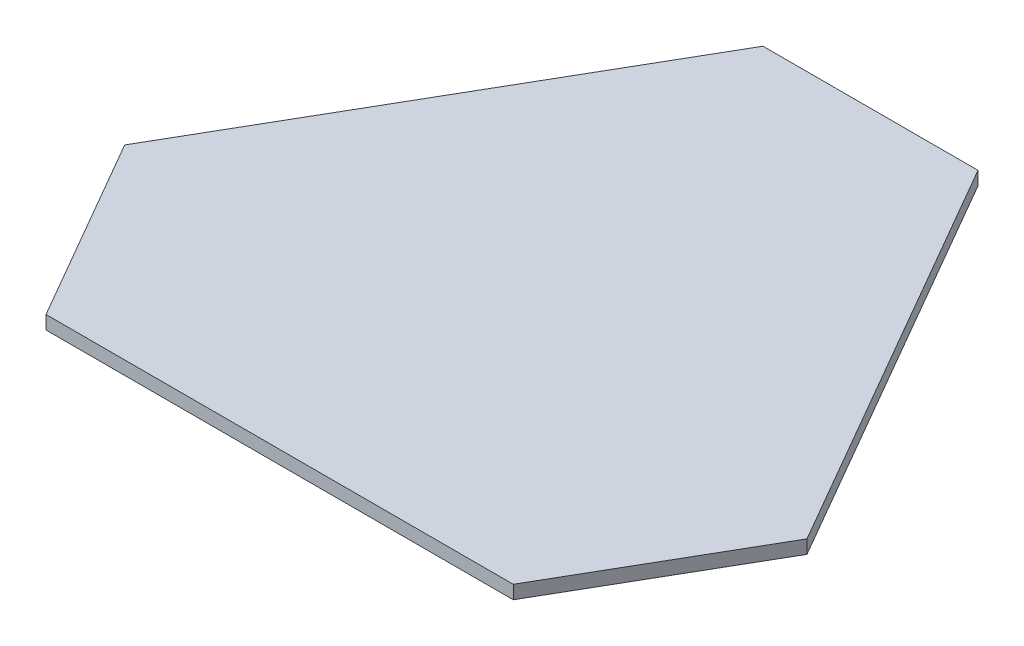
ISO-10303-21;
HEADER;
FILE_DESCRIPTION(('STEP AP214'),'2;1');
FILE_NAME('part.step','',(''),(''),'','','');
FILE_SCHEMA(('AUTOMOTIVE_DESIGN { 1 0 10303 214 1 1 1 1 }'));
ENDSEC;
DATA;
#1=APPLICATION_CONTEXT('core data for automotive mechanical design processes');
#2=APPLICATION_PROTOCOL_DEFINITION('international standard','automotive_design',2000,#1);
#3=PRODUCT_CONTEXT('',#1,'mechanical');
#4=PRODUCT('Part','Part','',(#3));
#5=PRODUCT_RELATED_PRODUCT_CATEGORY('part','',(#4));
#6=PRODUCT_DEFINITION_FORMATION('','',#4);
#7=PRODUCT_DEFINITION_CONTEXT('part definition',#1,'design');
#8=PRODUCT_DEFINITION('design','',#6,#7);
#9=PRODUCT_DEFINITION_SHAPE('','',#8);
#10=(LENGTH_UNIT() NAMED_UNIT(*) SI_UNIT(.MILLI.,.METRE.));
#11=(NAMED_UNIT(*) PLANE_ANGLE_UNIT() SI_UNIT($,.RADIAN.));
#12=(NAMED_UNIT(*) SI_UNIT($,.STERADIAN.) SOLID_ANGLE_UNIT());
#13=UNCERTAINTY_MEASURE_WITH_UNIT(LENGTH_MEASURE(1.E-05),#10,'distance_accuracy_value','');
#14=(GEOMETRIC_REPRESENTATION_CONTEXT(3) GLOBAL_UNCERTAINTY_ASSIGNED_CONTEXT((#13)) GLOBAL_UNIT_ASSIGNED_CONTEXT((#10,
#11,#12)) REPRESENTATION_CONTEXT('',''));
#15=CARTESIAN_POINT('',(0.,0.,0.));
#16=DIRECTION('',(0.,0.,1.));
#17=DIRECTION('',(1.,0.,0.));
#18=AXIS2_PLACEMENT_3D('',#15,#16,#17);
#19=CARTESIAN_POINT('',(-43.2725670041836,-2.5,12.5356925144772));
#20=DIRECTION('',(-0.866025403784438,0.,-0.5));
#21=DIRECTION('',(-0.5,0.,0.866025403784439));
#22=AXIS2_PLACEMENT_3D('',#19,#20,#21);
#23=PLANE('',#22);
#24=DIRECTION('',(-0.5,0.,0.866025403784439));
#25=VECTOR('',#24,1.);
#26=CARTESIAN_POINT('',(-43.2725670041836,0.,12.5356925144772));
#27=LINE('',#26,#25);
#28=CARTESIAN_POINT('',(0.194905288961848,0.,-62.7521779738431));
#29=VERTEX_POINT('',#28);
#30=CARTESIAN_POINT('',(-43.2725670041836,0.,12.5356925144772));
#31=VERTEX_POINT('',#30);
#32=EDGE_CURVE('E119',#29,#31,#27,.T.);
#33=ORIENTED_EDGE('',*,*,#32,.F.);
#34=DIRECTION('',(0.,1.,0.));
#35=VECTOR('',#34,1.);
#36=CARTESIAN_POINT('',(0.194905288961848,-2.5,-62.7521779738431));
#37=LINE('',#36,#35);
#38=CARTESIAN_POINT('',(0.194905288961848,-2.5,-62.7521779738431));
#39=VERTEX_POINT('',#38);
#40=EDGE_CURVE('E11',#39,#29,#37,.T.);
#41=ORIENTED_EDGE('',*,*,#40,.F.);
#42=DIRECTION('',(-0.5,0.,0.866025403784439));
#43=VECTOR('',#42,1.);
#44=CARTESIAN_POINT('',(-43.2725670041836,-2.5,12.5356925144772));
#45=LINE('',#44,#43);
#46=CARTESIAN_POINT('',(-43.2725670041836,-2.5,12.5356925144772));
#47=VERTEX_POINT('',#46);
#48=EDGE_CURVE('E133',#39,#47,#45,.T.);
#49=ORIENTED_EDGE('',*,*,#48,.T.);
#50=DIRECTION('',(0.,1.,0.));
#51=VECTOR('',#50,1.);
#52=CARTESIAN_POINT('',(-43.2725670041836,-2.5,12.5356925144772));
#53=LINE('',#52,#51);
#54=EDGE_CURVE('E37',#47,#31,#53,.T.);
#55=ORIENTED_EDGE('',*,*,#54,.T.);
#56=EDGE_LOOP('',(#33,#41,#49,#55));
#57=FACE_BOUND('',#56,.T.);
#58=ADVANCED_FACE('F34',(#57),#23,.T.);
#59=CARTESIAN_POINT('',(0.194905288961848,-2.5,-62.7521779738431));
#60=DIRECTION('',(0.,0.,-1.));
#61=DIRECTION('',(-1.,0.,0.));
#62=AXIS2_PLACEMENT_3D('',#59,#60,#61);
#63=PLANE('',#62);
#64=DIRECTION('',(-1.,0.,0.));
#65=VECTOR('',#64,1.);
#66=CARTESIAN_POINT('',(0.194905288961848,0.,-62.7521779738431));
#67=LINE('',#66,#65);
#68=CARTESIAN_POINT('',(40.194905196673,0.,-62.7521779738431));
#69=VERTEX_POINT('',#68);
#70=EDGE_CURVE('E131',#69,#29,#67,.T.);
#71=ORIENTED_EDGE('',*,*,#70,.F.);
#72=DIRECTION('',(0.,1.,0.));
#73=VECTOR('',#72,1.);
#74=CARTESIAN_POINT('',(40.194905196673,-2.5,-62.7521779738431));
#75=LINE('',#74,#73);
#76=CARTESIAN_POINT('',(40.194905196673,-2.5,-62.7521779738431));
#77=VERTEX_POINT('',#76);
#78=EDGE_CURVE('E43',#77,#69,#75,.T.);
#79=ORIENTED_EDGE('',*,*,#78,.F.);
#80=DIRECTION('',(-1.,0.,0.));
#81=VECTOR('',#80,1.);
#82=CARTESIAN_POINT('',(0.194905288961848,-2.5,-62.7521779738431));
#83=LINE('',#82,#81);
#84=EDGE_CURVE('E109',#77,#39,#83,.T.);
#85=ORIENTED_EDGE('',*,*,#84,.T.);
#86=ORIENTED_EDGE('',*,*,#40,.T.);
#87=EDGE_LOOP('',(#71,#79,#85,#86));
#88=FACE_BOUND('',#87,.T.);
#89=ADVANCED_FACE('F141',(#88),#63,.T.);
#90=CARTESIAN_POINT('',(40.194905196673,-2.5,-62.7521779738431));
#91=DIRECTION('',(0.866025403784438,0.,-0.5));
#92=DIRECTION('',(-0.5,0.,-0.866025403784438));
#93=AXIS2_PLACEMENT_3D('',#90,#91,#92);
#94=PLANE('',#93);
#95=DIRECTION('',(-0.5,0.,-0.866025403784438));
#96=VECTOR('',#95,1.);
#97=CARTESIAN_POINT('',(40.194905196673,0.,-62.7521779738431));
#98=LINE('',#97,#96);
#99=CARTESIAN_POINT('',(83.6623774898187,0.,12.5356925144775));
#100=VERTEX_POINT('',#99);
#101=EDGE_CURVE('E96',#100,#69,#98,.T.);
#102=ORIENTED_EDGE('',*,*,#101,.F.);
#103=DIRECTION('',(0.,1.,0.));
#104=VECTOR('',#103,1.);
#105=CARTESIAN_POINT('',(83.6623774898187,-2.5,12.5356925144775));
#106=LINE('',#105,#104);
#107=CARTESIAN_POINT('',(83.6623774898187,-2.5,12.5356925144775));
#108=VERTEX_POINT('',#107);
#109=EDGE_CURVE('E91',#108,#100,#106,.T.);
#110=ORIENTED_EDGE('',*,*,#109,.F.);
#111=DIRECTION('',(-0.5,0.,-0.866025403784438));
#112=VECTOR('',#111,1.);
#113=CARTESIAN_POINT('',(40.194905196673,-2.5,-62.7521779738431));
#114=LINE('',#113,#112);
#115=EDGE_CURVE('E94',#108,#77,#114,.T.);
#116=ORIENTED_EDGE('',*,*,#115,.T.);
#117=ORIENTED_EDGE('',*,*,#78,.T.);
#118=EDGE_LOOP('',(#102,#110,#116,#117));
#119=FACE_BOUND('',#118,.T.);
#120=ADVANCED_FACE('F93',(#119),#94,.T.);
#121=CARTESIAN_POINT('',(63.6623774898173,-2.5,47.1767086658542));
#122=DIRECTION('',(0.866025403784418,0.,0.500000000000036));
#123=DIRECTION('',(0.500000000000036,0.,-0.866025403784418));
#124=AXIS2_PLACEMENT_3D('',#121,#122,#123);
#125=PLANE('',#124);
#126=DIRECTION('',(0.500000000000036,0.,-0.866025403784418));
#127=VECTOR('',#126,1.);
#128=CARTESIAN_POINT('',(63.6623774898173,0.,47.1767086658542));
#129=LINE('',#128,#127);
#130=CARTESIAN_POINT('',(63.6623774898173,0.,47.1767086658542));
#131=VERTEX_POINT('',#130);
#132=EDGE_CURVE('E128',#131,#100,#129,.T.);
#133=ORIENTED_EDGE('',*,*,#132,.F.);
#134=DIRECTION('',(0.,1.,0.));
#135=VECTOR('',#134,1.);
#136=CARTESIAN_POINT('',(63.6623774898173,-2.5,47.1767086658542));
#137=LINE('',#136,#135);
#138=CARTESIAN_POINT('',(63.6623774898173,-2.5,47.1767086658542));
#139=VERTEX_POINT('',#138);
#140=EDGE_CURVE('E101',#139,#131,#137,.T.);
#141=ORIENTED_EDGE('',*,*,#140,.F.);
#142=DIRECTION('',(0.500000000000036,0.,-0.866025403784418));
#143=VECTOR('',#142,1.);
#144=CARTESIAN_POINT('',(63.6623774898173,-2.5,47.1767086658542));
#145=LINE('',#144,#143);
#146=EDGE_CURVE('E107',#139,#108,#145,.T.);
#147=ORIENTED_EDGE('',*,*,#146,.T.);
#148=ORIENTED_EDGE('',*,*,#109,.T.);
#149=EDGE_LOOP('',(#133,#141,#147,#148));
#150=FACE_BOUND('',#149,.T.);
#151=ADVANCED_FACE('F111',(#150),#125,.T.);
#152=CARTESIAN_POINT('',(63.6623774898173,-2.5,47.1767086658542));
#153=DIRECTION('',(0.,0.,1.));
#154=DIRECTION('',(1.,0.,0.));
#155=AXIS2_PLACEMENT_3D('',#152,#153,#154);
#156=PLANE('',#155);
#157=DIRECTION('',(1.,0.,0.));
#158=VECTOR('',#157,1.);
#159=CARTESIAN_POINT('',(63.6623774898173,0.,47.1767086658542));
#160=LINE('',#159,#158);
#161=CARTESIAN_POINT('',(-23.2725670041827,0.,47.1767086658542));
#162=VERTEX_POINT('',#161);
#163=EDGE_CURVE('E125',#162,#131,#160,.T.);
#164=ORIENTED_EDGE('',*,*,#163,.F.);
#165=DIRECTION('',(0.,1.,0.));
#166=VECTOR('',#165,1.);
#167=CARTESIAN_POINT('',(-23.2725670041827,-2.5,47.1767086658542));
#168=LINE('',#167,#166);
#169=CARTESIAN_POINT('',(-23.2725670041827,-2.5,47.1767086658542));
#170=VERTEX_POINT('',#169);
#171=EDGE_CURVE('E136',#170,#162,#168,.T.);
#172=ORIENTED_EDGE('',*,*,#171,.F.);
#173=DIRECTION('',(1.,0.,0.));
#174=VECTOR('',#173,1.);
#175=CARTESIAN_POINT('',(63.6623774898173,-2.5,47.1767086658542));
#176=LINE('',#175,#174);
#177=EDGE_CURVE('E112',#170,#139,#176,.T.);
#178=ORIENTED_EDGE('',*,*,#177,.T.);
#179=ORIENTED_EDGE('',*,*,#140,.T.);
#180=EDGE_LOOP('',(#164,#172,#178,#179));
#181=FACE_BOUND('',#180,.T.);
#182=ADVANCED_FACE('F154',(#181),#156,.T.);
#183=CARTESIAN_POINT('',(-23.2725670041827,-2.5,47.1767086658542));
#184=DIRECTION('',(-0.866025403784425,0.,0.500000000000024));
#185=DIRECTION('',(0.500000000000024,0.,0.866025403784425));
#186=AXIS2_PLACEMENT_3D('',#183,#184,#185);
#187=PLANE('',#186);
#188=DIRECTION('',(0.500000000000024,0.,0.866025403784425));
#189=VECTOR('',#188,1.);
#190=CARTESIAN_POINT('',(-23.2725670041827,0.,47.1767086658542));
#191=LINE('',#190,#189);
#192=EDGE_CURVE('E122',#31,#162,#191,.T.);
#193=ORIENTED_EDGE('',*,*,#192,.F.);
#194=ORIENTED_EDGE('',*,*,#54,.F.);
#195=DIRECTION('',(0.500000000000024,0.,0.866025403784425));
#196=VECTOR('',#195,1.);
#197=CARTESIAN_POINT('',(-23.2725670041827,-2.5,47.1767086658542));
#198=LINE('',#197,#196);
#199=EDGE_CURVE('E114',#47,#170,#198,.T.);
#200=ORIENTED_EDGE('',*,*,#199,.T.);
#201=ORIENTED_EDGE('',*,*,#171,.T.);
#202=EDGE_LOOP('',(#193,#194,#200,#201));
#203=FACE_BOUND('',#202,.T.);
#204=ADVANCED_FACE('F138',(#203),#187,.T.);
#205=CARTESIAN_POINT('',(0.,-2.5,0.));
#206=DIRECTION('',(0.,-1.,0.));
#207=DIRECTION('',(0.,0.,-1.));
#208=AXIS2_PLACEMENT_3D('',#205,#206,#207);
#209=PLANE('',#208);
#210=ORIENTED_EDGE('',*,*,#48,.F.);
#211=ORIENTED_EDGE('',*,*,#84,.F.);
#212=ORIENTED_EDGE('',*,*,#115,.F.);
#213=ORIENTED_EDGE('',*,*,#146,.F.);
#214=ORIENTED_EDGE('',*,*,#177,.F.);
#215=ORIENTED_EDGE('',*,*,#199,.F.);
#216=EDGE_LOOP('',(#210,#211,#212,#213,#214,#215));
#217=FACE_BOUND('',#216,.T.);
#218=ADVANCED_FACE('F105',(#217),#209,.T.);
#219=CARTESIAN_POINT('',(0.,0.,0.));
#220=DIRECTION('',(0.,-1.,0.));
#221=DIRECTION('',(0.,0.,-1.));
#222=AXIS2_PLACEMENT_3D('',#219,#220,#221);
#223=PLANE('',#222);
#224=ORIENTED_EDGE('',*,*,#32,.T.);
#225=ORIENTED_EDGE('',*,*,#192,.T.);
#226=ORIENTED_EDGE('',*,*,#163,.T.);
#227=ORIENTED_EDGE('',*,*,#132,.T.);
#228=ORIENTED_EDGE('',*,*,#101,.T.);
#229=ORIENTED_EDGE('',*,*,#70,.T.);
#230=EDGE_LOOP('',(#224,#225,#226,#227,#228,#229));
#231=FACE_BOUND('',#230,.T.);
#232=ADVANCED_FACE('F140',(#231),#223,.F.);
#233=CLOSED_SHELL('',(#58,#89,#120,#151,#182,#204,#218,#232));
#234=MANIFOLD_SOLID_BREP('B2',#233);
#235=ADVANCED_BREP_SHAPE_REPRESENTATION('',(#18,#234),#14);
#236=SHAPE_DEFINITION_REPRESENTATION(#9,#235);
ENDSEC;
END-ISO-10303-21;
